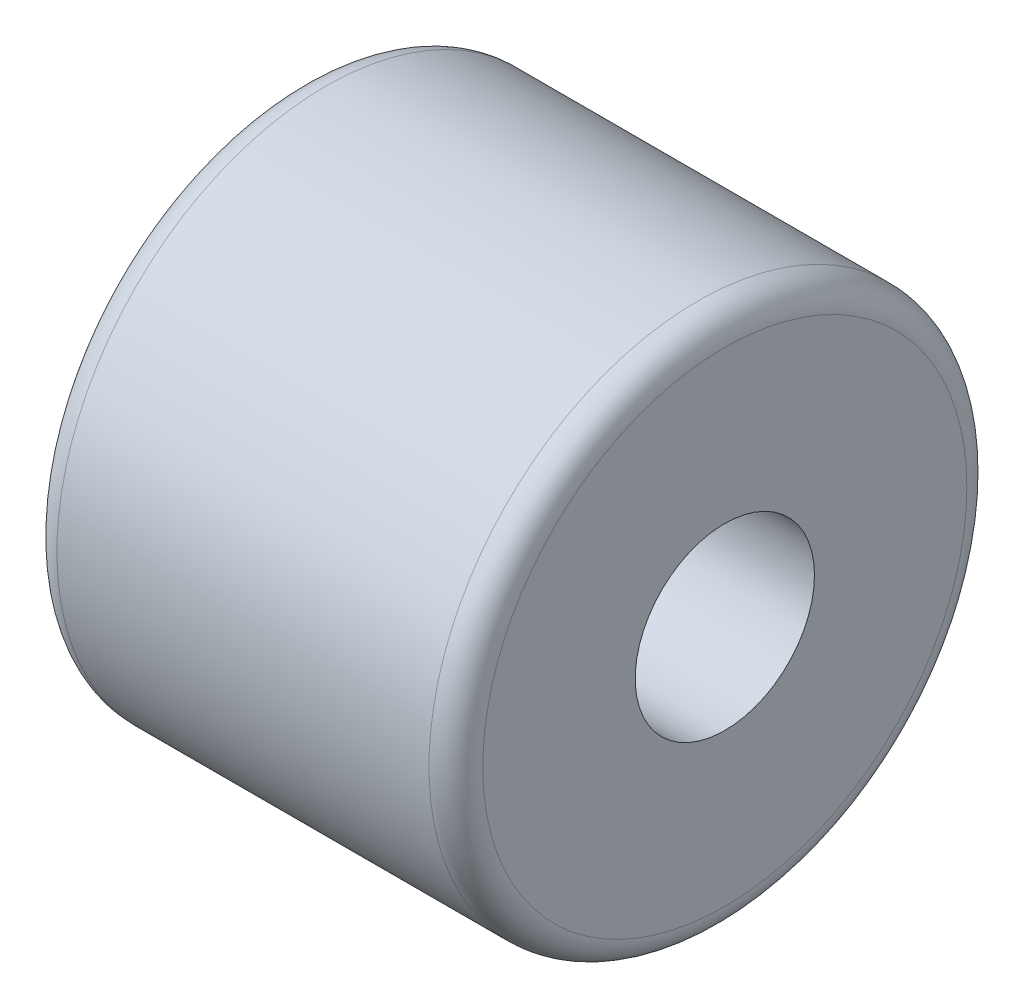
ISO-10303-21;
HEADER;
FILE_DESCRIPTION(('STEP AP214'),'2;1');
FILE_NAME('part.step','',(''),(''),'','','');
FILE_SCHEMA(('AUTOMOTIVE_DESIGN { 1 0 10303 214 1 1 1 1 }'));
ENDSEC;
DATA;
#1=APPLICATION_CONTEXT('core data for automotive mechanical design processes');
#2=APPLICATION_PROTOCOL_DEFINITION('international standard','automotive_design',2000,#1);
#3=PRODUCT_CONTEXT('',#1,'mechanical');
#4=PRODUCT('Part','Part','',(#3));
#5=PRODUCT_RELATED_PRODUCT_CATEGORY('part','',(#4));
#6=PRODUCT_DEFINITION_FORMATION('','',#4);
#7=PRODUCT_DEFINITION_CONTEXT('part definition',#1,'design');
#8=PRODUCT_DEFINITION('design','',#6,#7);
#9=PRODUCT_DEFINITION_SHAPE('','',#8);
#10=(LENGTH_UNIT() NAMED_UNIT(*) SI_UNIT(.MILLI.,.METRE.));
#11=(NAMED_UNIT(*) PLANE_ANGLE_UNIT() SI_UNIT($,.RADIAN.));
#12=(NAMED_UNIT(*) SI_UNIT($,.STERADIAN.) SOLID_ANGLE_UNIT());
#13=UNCERTAINTY_MEASURE_WITH_UNIT(LENGTH_MEASURE(1.E-05),#10,'distance_accuracy_value','');
#14=(GEOMETRIC_REPRESENTATION_CONTEXT(3) GLOBAL_UNCERTAINTY_ASSIGNED_CONTEXT((#13)) GLOBAL_UNIT_ASSIGNED_CONTEXT((#10,
#11,#12)) REPRESENTATION_CONTEXT('',''));
#15=CARTESIAN_POINT('',(0.,0.,0.));
#16=DIRECTION('',(0.,0.,1.));
#17=DIRECTION('',(1.,0.,0.));
#18=AXIS2_PLACEMENT_3D('',#15,#16,#17);
#19=CARTESIAN_POINT('',(4.75,0.,0.));
#20=DIRECTION('',(1.,0.,0.));
#21=DIRECTION('',(0.,0.,-1.));
#22=AXIS2_PLACEMENT_3D('',#19,#20,#21);
#23=PLANE('',#22);
#24=CARTESIAN_POINT('',(4.75,0.,0.));
#25=DIRECTION('',(1.,0.,0.));
#26=DIRECTION('',(0.,0.,-1.));
#27=AXIS2_PLACEMENT_3D('',#24,#25,#26);
#28=CIRCLE('',#27,5.4);
#29=CARTESIAN_POINT('',(4.75,0.,-5.4));
#30=VERTEX_POINT('',#29);
#31=EDGE_CURVE('E48',#30,#30,#28,.T.);
#32=ORIENTED_EDGE('',*,*,#31,.T.);
#33=EDGE_LOOP('',(#32));
#34=FACE_BOUND('',#33,.T.);
#35=CARTESIAN_POINT('',(4.75,0.,0.));
#36=DIRECTION('',(1.,0.,0.));
#37=DIRECTION('',(0.,0.,-1.));
#38=AXIS2_PLACEMENT_3D('',#35,#36,#37);
#39=CIRCLE('',#38,2.);
#40=CARTESIAN_POINT('',(4.75,0.,-2.));
#41=VERTEX_POINT('',#40);
#42=EDGE_CURVE('E53',#41,#41,#39,.T.);
#43=ORIENTED_EDGE('',*,*,#42,.F.);
#44=EDGE_LOOP('',(#43));
#45=FACE_BOUND('',#44,.T.);
#46=ADVANCED_FACE('F33',(#34,#45),#23,.T.);
#47=CARTESIAN_POINT('',(-4.75,0.,0.));
#48=DIRECTION('',(1.,0.,0.));
#49=DIRECTION('',(0.,0.,-1.));
#50=AXIS2_PLACEMENT_3D('',#47,#48,#49);
#51=PLANE('',#50);
#52=CARTESIAN_POINT('',(-4.75,0.,0.));
#53=DIRECTION('',(1.,0.,0.));
#54=DIRECTION('',(0.,0.,-1.));
#55=AXIS2_PLACEMENT_3D('',#52,#53,#54);
#56=CIRCLE('',#55,5.4);
#57=CARTESIAN_POINT('',(-4.75,0.,-5.4));
#58=VERTEX_POINT('',#57);
#59=EDGE_CURVE('E10',#58,#58,#56,.F.);
#60=ORIENTED_EDGE('',*,*,#59,.T.);
#61=EDGE_LOOP('',(#60));
#62=FACE_BOUND('',#61,.T.);
#63=CARTESIAN_POINT('',(-4.75,0.,0.));
#64=DIRECTION('',(1.,0.,0.));
#65=DIRECTION('',(0.,0.,-1.));
#66=AXIS2_PLACEMENT_3D('',#63,#64,#65);
#67=CIRCLE('',#66,2.);
#68=CARTESIAN_POINT('',(-4.75,0.,-2.));
#69=VERTEX_POINT('',#68);
#70=EDGE_CURVE('E54',#69,#69,#67,.T.);
#71=ORIENTED_EDGE('',*,*,#70,.T.);
#72=EDGE_LOOP('',(#71));
#73=FACE_BOUND('',#72,.T.);
#74=ADVANCED_FACE('F64',(#62,#73),#51,.F.);
#75=CARTESIAN_POINT('',(4.75,0.,0.));
#76=DIRECTION('',(-1.,0.,0.));
#77=DIRECTION('',(0.,0.,1.));
#78=AXIS2_PLACEMENT_3D('',#75,#76,#77);
#79=CYLINDRICAL_SURFACE('',#78,6.);
#80=CARTESIAN_POINT('',(4.15,0.,0.));
#81=DIRECTION('',(1.,0.,0.));
#82=DIRECTION('',(0.,0.,-1.));
#83=AXIS2_PLACEMENT_3D('',#80,#81,#82);
#84=CIRCLE('',#83,6.);
#85=CARTESIAN_POINT('',(4.15,0.,-6.));
#86=VERTEX_POINT('',#85);
#87=EDGE_CURVE('E40',#86,#86,#84,.F.);
#88=ORIENTED_EDGE('',*,*,#87,.T.);
#89=EDGE_LOOP('',(#88));
#90=FACE_BOUND('',#89,.T.);
#91=CARTESIAN_POINT('',(-4.15,0.,0.));
#92=DIRECTION('',(1.,0.,0.));
#93=DIRECTION('',(0.,0.,-1.));
#94=AXIS2_PLACEMENT_3D('',#91,#92,#93);
#95=CIRCLE('',#94,6.);
#96=CARTESIAN_POINT('',(-4.15,0.,-6.));
#97=VERTEX_POINT('',#96);
#98=EDGE_CURVE('E44',#97,#97,#95,.T.);
#99=ORIENTED_EDGE('',*,*,#98,.T.);
#100=EDGE_LOOP('',(#99));
#101=FACE_BOUND('',#100,.T.);
#102=ADVANCED_FACE('F70',(#90,#101),#79,.T.);
#103=CARTESIAN_POINT('',(4.75,0.,0.));
#104=DIRECTION('',(-1.,0.,0.));
#105=DIRECTION('',(0.,0.,1.));
#106=AXIS2_PLACEMENT_3D('',#103,#104,#105);
#107=CYLINDRICAL_SURFACE('',#106,2.);
#108=ORIENTED_EDGE('',*,*,#42,.T.);
#109=EDGE_LOOP('',(#108));
#110=FACE_BOUND('',#109,.T.);
#111=ORIENTED_EDGE('',*,*,#70,.F.);
#112=EDGE_LOOP('',(#111));
#113=FACE_BOUND('',#112,.T.);
#114=ADVANCED_FACE('F60',(#110,#113),#107,.F.);
#115=CARTESIAN_POINT('',(4.15,0.,0.));
#116=DIRECTION('',(1.,0.,0.));
#117=DIRECTION('',(0.,0.,-1.));
#118=AXIS2_PLACEMENT_3D('',#115,#116,#117);
#119=TOROIDAL_SURFACE('',#118,5.4,0.6);
#120=ORIENTED_EDGE('',*,*,#87,.F.);
#121=EDGE_LOOP('',(#120));
#122=FACE_BOUND('',#121,.T.);
#123=ORIENTED_EDGE('',*,*,#31,.F.);
#124=EDGE_LOOP('',(#123));
#125=FACE_BOUND('',#124,.T.);
#126=ADVANCED_FACE('F75',(#122,#125),#119,.T.);
#127=CARTESIAN_POINT('',(-4.15,0.,0.));
#128=DIRECTION('',(1.,0.,0.));
#129=DIRECTION('',(0.,0.,-1.));
#130=AXIS2_PLACEMENT_3D('',#127,#128,#129);
#131=TOROIDAL_SURFACE('',#130,5.4,0.6);
#132=ORIENTED_EDGE('',*,*,#59,.F.);
#133=EDGE_LOOP('',(#132));
#134=FACE_BOUND('',#133,.T.);
#135=ORIENTED_EDGE('',*,*,#98,.F.);
#136=EDGE_LOOP('',(#135));
#137=FACE_BOUND('',#136,.T.);
#138=ADVANCED_FACE('F35',(#134,#137),#131,.T.);
#139=CLOSED_SHELL('',(#46,#74,#102,#114,#126,#138));
#140=MANIFOLD_SOLID_BREP('B2',#139);
#141=ADVANCED_BREP_SHAPE_REPRESENTATION('',(#18,#140),#14);
#142=SHAPE_DEFINITION_REPRESENTATION(#9,#141);
ENDSEC;
END-ISO-10303-21;
